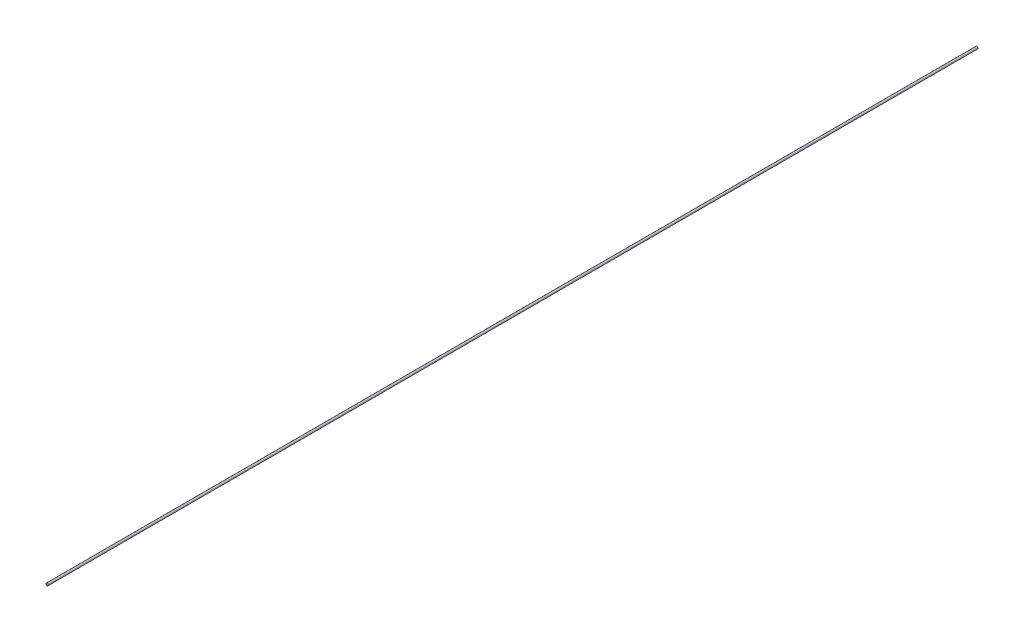
ISO-10303-21;
HEADER;
FILE_DESCRIPTION(('STEP AP214'),'2;1');
FILE_NAME('part.step','',(''),(''),'','','');
FILE_SCHEMA(('AUTOMOTIVE_DESIGN { 1 0 10303 214 1 1 1 1 }'));
ENDSEC;
DATA;
#1=APPLICATION_CONTEXT('core data for automotive mechanical design processes');
#2=APPLICATION_PROTOCOL_DEFINITION('international standard','automotive_design',2000,#1);
#3=PRODUCT_CONTEXT('',#1,'mechanical');
#4=PRODUCT('Part','Part','',(#3));
#5=PRODUCT_RELATED_PRODUCT_CATEGORY('part','',(#4));
#6=PRODUCT_DEFINITION_FORMATION('','',#4);
#7=PRODUCT_DEFINITION_CONTEXT('part definition',#1,'design');
#8=PRODUCT_DEFINITION('design','',#6,#7);
#9=PRODUCT_DEFINITION_SHAPE('','',#8);
#10=(LENGTH_UNIT() NAMED_UNIT(*) SI_UNIT(.MILLI.,.METRE.));
#11=(NAMED_UNIT(*) PLANE_ANGLE_UNIT() SI_UNIT($,.RADIAN.));
#12=(NAMED_UNIT(*) SI_UNIT($,.STERADIAN.) SOLID_ANGLE_UNIT());
#13=UNCERTAINTY_MEASURE_WITH_UNIT(LENGTH_MEASURE(1.E-05),#10,'distance_accuracy_value','');
#14=(GEOMETRIC_REPRESENTATION_CONTEXT(3) GLOBAL_UNCERTAINTY_ASSIGNED_CONTEXT((#13)) GLOBAL_UNIT_ASSIGNED_CONTEXT((#10,
#11,#12)) REPRESENTATION_CONTEXT('',''));
#15=CARTESIAN_POINT('',(0.,0.,0.));
#16=DIRECTION('',(0.,0.,1.));
#17=DIRECTION('',(1.,0.,0.));
#18=AXIS2_PLACEMENT_3D('',#15,#16,#17);
#19=CARTESIAN_POINT('',(0.,0.,177.8));
#20=DIRECTION('',(0.,0.,-1.));
#21=DIRECTION('',(-1.,0.,0.));
#22=AXIS2_PLACEMENT_3D('',#19,#20,#21);
#23=CYLINDRICAL_SURFACE('',#22,0.2159);
#24=CARTESIAN_POINT('',(0.,0.,177.8));
#25=DIRECTION('',(0.,0.,1.));
#26=DIRECTION('',(1.,0.,0.));
#27=AXIS2_PLACEMENT_3D('',#24,#25,#26);
#28=CIRCLE('',#27,0.2159);
#29=CARTESIAN_POINT('',(0.2159,0.,177.8));
#30=VERTEX_POINT('',#29);
#31=EDGE_CURVE('E10',#30,#30,#28,.T.);
#32=ORIENTED_EDGE('',*,*,#31,.F.);
#33=EDGE_LOOP('',(#32));
#34=FACE_BOUND('',#33,.T.);
#35=CARTESIAN_POINT('',(0.,0.,0.));
#36=DIRECTION('',(0.,0.,1.));
#37=DIRECTION('',(1.,0.,0.));
#38=AXIS2_PLACEMENT_3D('',#35,#36,#37);
#39=CIRCLE('',#38,0.2159);
#40=CARTESIAN_POINT('',(0.2159,0.,0.));
#41=VERTEX_POINT('',#40);
#42=EDGE_CURVE('E40',#41,#41,#39,.T.);
#43=ORIENTED_EDGE('',*,*,#42,.T.);
#44=EDGE_LOOP('',(#43));
#45=FACE_BOUND('',#44,.T.);
#46=ADVANCED_FACE('F37',(#34,#45),#23,.T.);
#47=CARTESIAN_POINT('',(0.,0.,177.8));
#48=DIRECTION('',(0.,0.,1.));
#49=DIRECTION('',(1.,0.,0.));
#50=AXIS2_PLACEMENT_3D('',#47,#48,#49);
#51=PLANE('',#50);
#52=ORIENTED_EDGE('',*,*,#31,.T.);
#53=EDGE_LOOP('',(#52));
#54=FACE_BOUND('',#53,.T.);
#55=ADVANCED_FACE('F54',(#54),#51,.T.);
#56=CARTESIAN_POINT('',(0.,0.,0.));
#57=DIRECTION('',(0.,0.,1.));
#58=DIRECTION('',(1.,0.,0.));
#59=AXIS2_PLACEMENT_3D('',#56,#57,#58);
#60=PLANE('',#59);
#61=ORIENTED_EDGE('',*,*,#42,.F.);
#62=EDGE_LOOP('',(#61));
#63=FACE_BOUND('',#62,.T.);
#64=ADVANCED_FACE('F52',(#63),#60,.F.);
#65=CLOSED_SHELL('',(#46,#55,#64));
#66=MANIFOLD_SOLID_BREP('B2',#65);
#67=ADVANCED_BREP_SHAPE_REPRESENTATION('',(#18,#66),#14);
#68=SHAPE_DEFINITION_REPRESENTATION(#9,#67);
ENDSEC;
END-ISO-10303-21;
